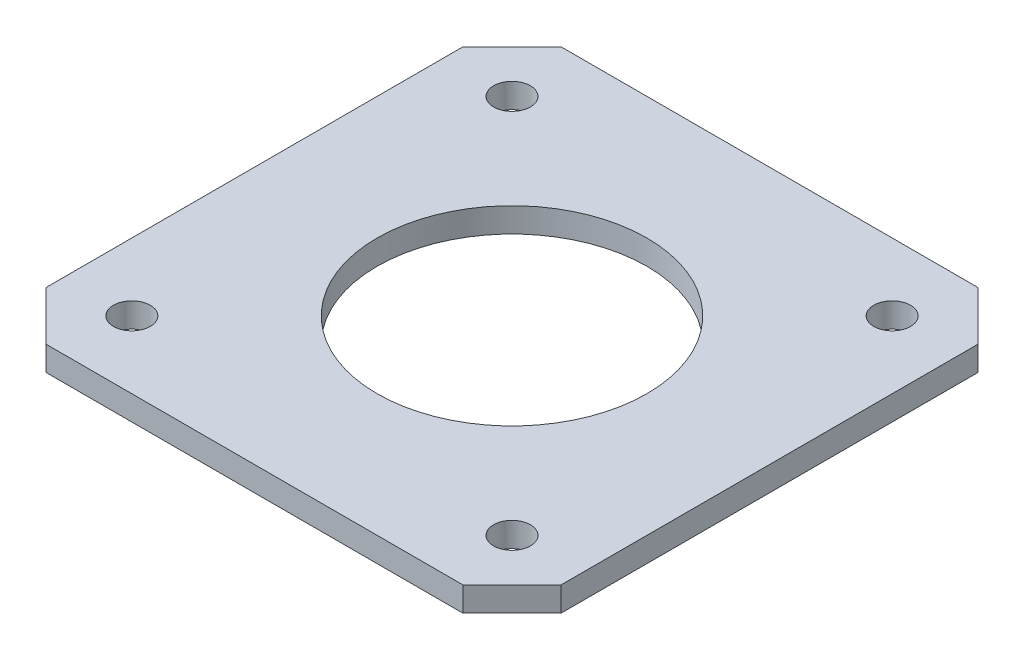
ISO-10303-21;
HEADER;
FILE_DESCRIPTION(('STEP AP214'),'2;1');
FILE_NAME('part.step','',(''),(''),'','','');
FILE_SCHEMA(('AUTOMOTIVE_DESIGN { 1 0 10303 214 1 1 1 1 }'));
ENDSEC;
DATA;
#1=APPLICATION_CONTEXT('core data for automotive mechanical design processes');
#2=APPLICATION_PROTOCOL_DEFINITION('international standard','automotive_design',2000,#1);
#3=PRODUCT_CONTEXT('',#1,'mechanical');
#4=PRODUCT('Part','Part','',(#3));
#5=PRODUCT_RELATED_PRODUCT_CATEGORY('part','',(#4));
#6=PRODUCT_DEFINITION_FORMATION('','',#4);
#7=PRODUCT_DEFINITION_CONTEXT('part definition',#1,'design');
#8=PRODUCT_DEFINITION('design','',#6,#7);
#9=PRODUCT_DEFINITION_SHAPE('','',#8);
#10=(LENGTH_UNIT() NAMED_UNIT(*) SI_UNIT(.MILLI.,.METRE.));
#11=(NAMED_UNIT(*) PLANE_ANGLE_UNIT() SI_UNIT($,.RADIAN.));
#12=(NAMED_UNIT(*) SI_UNIT($,.STERADIAN.) SOLID_ANGLE_UNIT());
#13=UNCERTAINTY_MEASURE_WITH_UNIT(LENGTH_MEASURE(1.E-05),#10,'distance_accuracy_value','');
#14=(GEOMETRIC_REPRESENTATION_CONTEXT(3) GLOBAL_UNCERTAINTY_ASSIGNED_CONTEXT((#13)) GLOBAL_UNIT_ASSIGNED_CONTEXT((#10,
#11,#12)) REPRESENTATION_CONTEXT('',''));
#15=CARTESIAN_POINT('',(0.,0.,0.));
#16=DIRECTION('',(0.,0.,1.));
#17=DIRECTION('',(1.,0.,0.));
#18=AXIS2_PLACEMENT_3D('',#15,#16,#17);
#19=CARTESIAN_POINT('',(0.,11.9638672342777,0.));
#20=DIRECTION('',(0.,1.,0.));
#21=DIRECTION('',(0.,0.,1.));
#22=AXIS2_PLACEMENT_3D('',#19,#20,#21);
#23=PLANE('',#22);
#24=CARTESIAN_POINT('',(71.5224899091758,11.9638672342777,-55.6486117539524));
#25=DIRECTION('',(0.,1.,0.));
#26=DIRECTION('',(0.,0.,1.));
#27=AXIS2_PLACEMENT_3D('',#24,#25,#26);
#28=CIRCLE('',#27,1.5);
#29=CARTESIAN_POINT('',(71.5224899091758,11.9638672342777,-54.1486117539524));
#30=VERTEX_POINT('',#29);
#31=EDGE_CURVE('E195',#30,#30,#28,.T.);
#32=ORIENTED_EDGE('',*,*,#31,.F.);
#33=EDGE_LOOP('',(#32));
#34=FACE_BOUND('',#33,.T.);
#35=CARTESIAN_POINT('',(40.5224899091758,11.9638672342777,-24.6486117539522));
#36=DIRECTION('',(0.,1.,0.));
#37=DIRECTION('',(0.,0.,1.));
#38=AXIS2_PLACEMENT_3D('',#35,#36,#37);
#39=CIRCLE('',#38,1.5);
#40=CARTESIAN_POINT('',(40.5224899091758,11.9638672342777,-23.1486117539522));
#41=VERTEX_POINT('',#40);
#42=EDGE_CURVE('E183',#41,#41,#39,.T.);
#43=ORIENTED_EDGE('',*,*,#42,.F.);
#44=EDGE_LOOP('',(#43));
#45=FACE_BOUND('',#44,.T.);
#46=DIRECTION('',(-1.,0.,0.));
#47=VECTOR('',#46,1.);
#48=CARTESIAN_POINT('',(73.0224899091758,11.9638672342777,-61.1486117539523));
#49=LINE('',#48,#47);
#50=CARTESIAN_POINT('',(73.0224899091758,11.9638672342777,-61.1486117539523));
#51=VERTEX_POINT('',#50);
#52=CARTESIAN_POINT('',(39.0224899091759,11.9638672342777,-61.1486117539523));
#53=VERTEX_POINT('',#52);
#54=EDGE_CURVE('E146',#51,#53,#49,.T.);
#55=ORIENTED_EDGE('',*,*,#54,.T.);
#56=DIRECTION('',(-0.707106781186546,0.,0.707106781186549));
#57=VECTOR('',#56,1.);
#58=CARTESIAN_POINT('',(39.0224899091759,11.9638672342777,-61.1486117539523));
#59=LINE('',#58,#57);
#60=CARTESIAN_POINT('',(35.0224899091758,11.9638672342777,-57.1486117539523));
#61=VERTEX_POINT('',#60);
#62=EDGE_CURVE('E94',#53,#61,#59,.T.);
#63=ORIENTED_EDGE('',*,*,#62,.T.);
#64=DIRECTION('',(0.,0.,1.));
#65=VECTOR('',#64,1.);
#66=CARTESIAN_POINT('',(35.0224899091758,11.9638672342777,-57.1486117539523));
#67=LINE('',#66,#65);
#68=CARTESIAN_POINT('',(35.0224899091758,11.9638672342777,-23.1486117539523));
#69=VERTEX_POINT('',#68);
#70=EDGE_CURVE('E161',#61,#69,#67,.T.);
#71=ORIENTED_EDGE('',*,*,#70,.T.);
#72=DIRECTION('',(0.707106781186546,0.,0.707106781186549));
#73=VECTOR('',#72,1.);
#74=CARTESIAN_POINT('',(35.0224899091758,11.9638672342777,-23.1486117539523));
#75=LINE('',#74,#73);
#76=CARTESIAN_POINT('',(39.0224899091758,11.9638672342777,-19.1486117539523));
#77=VERTEX_POINT('',#76);
#78=EDGE_CURVE('E174',#69,#77,#75,.T.);
#79=ORIENTED_EDGE('',*,*,#78,.T.);
#80=DIRECTION('',(1.,0.,0.));
#81=VECTOR('',#80,1.);
#82=CARTESIAN_POINT('',(39.0224899091758,11.9638672342777,-19.1486117539523));
#83=LINE('',#82,#81);
#84=CARTESIAN_POINT('',(73.0224899091758,11.9638672342777,-19.1486117539523));
#85=VERTEX_POINT('',#84);
#86=EDGE_CURVE('E113',#77,#85,#83,.T.);
#87=ORIENTED_EDGE('',*,*,#86,.T.);
#88=DIRECTION('',(0.707106781186549,0.,-0.707106781186546));
#89=VECTOR('',#88,1.);
#90=CARTESIAN_POINT('',(73.0224899091758,11.9638672342777,-19.1486117539523));
#91=LINE('',#90,#89);
#92=CARTESIAN_POINT('',(77.0224899091758,11.9638672342777,-23.1486117539523));
#93=VERTEX_POINT('',#92);
#94=EDGE_CURVE('E107',#85,#93,#91,.T.);
#95=ORIENTED_EDGE('',*,*,#94,.T.);
#96=DIRECTION('',(0.,0.,-1.));
#97=VECTOR('',#96,1.);
#98=CARTESIAN_POINT('',(77.0224899091758,11.9638672342777,-23.1486117539523));
#99=LINE('',#98,#97);
#100=CARTESIAN_POINT('',(77.0224899091758,11.9638672342777,-57.1486117539523));
#101=VERTEX_POINT('',#100);
#102=EDGE_CURVE('E111',#93,#101,#99,.T.);
#103=ORIENTED_EDGE('',*,*,#102,.T.);
#104=DIRECTION('',(-0.707106781186547,0.,-0.707106781186548));
#105=VECTOR('',#104,1.);
#106=CARTESIAN_POINT('',(77.0224899091758,11.9638672342777,-57.1486117539523));
#107=LINE('',#106,#105);
#108=EDGE_CURVE('E51',#101,#51,#107,.T.);
#109=ORIENTED_EDGE('',*,*,#108,.T.);
#110=EDGE_LOOP('',(#55,#63,#71,#79,#87,#95,#103,#109));
#111=FACE_BOUND('',#110,.T.);
#112=CARTESIAN_POINT('',(56.0224899091758,11.9638672342777,-40.1486117539523));
#113=DIRECTION('',(0.,1.,0.));
#114=DIRECTION('',(0.,0.,1.));
#115=AXIS2_PLACEMENT_3D('',#112,#113,#114);
#116=CIRCLE('',#115,11.);
#117=CARTESIAN_POINT('',(56.0224899091758,11.9638672342777,-29.1486117539523));
#118=VERTEX_POINT('',#117);
#119=EDGE_CURVE('E135',#118,#118,#116,.T.);
#120=ORIENTED_EDGE('',*,*,#119,.F.);
#121=EDGE_LOOP('',(#120));
#122=FACE_BOUND('',#121,.T.);
#123=CARTESIAN_POINT('',(71.5224899091759,11.9638672342777,-24.6486117539522));
#124=DIRECTION('',(0.,1.,0.));
#125=DIRECTION('',(0.,0.,1.));
#126=AXIS2_PLACEMENT_3D('',#123,#124,#125);
#127=CIRCLE('',#126,1.5);
#128=CARTESIAN_POINT('',(71.5224899091759,11.9638672342777,-23.1486117539523));
#129=VERTEX_POINT('',#128);
#130=EDGE_CURVE('E189',#129,#129,#127,.T.);
#131=ORIENTED_EDGE('',*,*,#130,.F.);
#132=EDGE_LOOP('',(#131));
#133=FACE_BOUND('',#132,.T.);
#134=CARTESIAN_POINT('',(40.5224899091759,11.9638672342777,-55.6486117539525));
#135=DIRECTION('',(0.,1.,0.));
#136=DIRECTION('',(0.,0.,1.));
#137=AXIS2_PLACEMENT_3D('',#134,#135,#136);
#138=CIRCLE('',#137,1.5);
#139=CARTESIAN_POINT('',(40.5224899091759,11.9638672342777,-54.1486117539525));
#140=VERTEX_POINT('',#139);
#141=EDGE_CURVE('E201',#140,#140,#138,.T.);
#142=ORIENTED_EDGE('',*,*,#141,.F.);
#143=EDGE_LOOP('',(#142));
#144=FACE_BOUND('',#143,.T.);
#145=ADVANCED_FACE('F34',(#34,#45,#111,#122,#133,#144),#23,.T.);
#146=CARTESIAN_POINT('',(0.,9.9638672342777,0.));
#147=DIRECTION('',(0.,1.,0.));
#148=DIRECTION('',(0.,0.,1.));
#149=AXIS2_PLACEMENT_3D('',#146,#147,#148);
#150=PLANE('',#149);
#151=DIRECTION('',(-1.,0.,0.));
#152=VECTOR('',#151,1.);
#153=CARTESIAN_POINT('',(73.0224899091758,9.9638672342777,-61.1486117539523));
#154=LINE('',#153,#152);
#155=CARTESIAN_POINT('',(73.0224899091758,9.9638672342777,-61.1486117539523));
#156=VERTEX_POINT('',#155);
#157=CARTESIAN_POINT('',(39.0224899091759,9.9638672342777,-61.1486117539523));
#158=VERTEX_POINT('',#157);
#159=EDGE_CURVE('E131',#156,#158,#154,.T.);
#160=ORIENTED_EDGE('',*,*,#159,.F.);
#161=DIRECTION('',(-0.707106781186547,0.,-0.707106781186548));
#162=VECTOR('',#161,1.);
#163=CARTESIAN_POINT('',(77.0224899091758,9.9638672342777,-57.1486117539523));
#164=LINE('',#163,#162);
#165=CARTESIAN_POINT('',(77.0224899091758,9.9638672342777,-57.1486117539523));
#166=VERTEX_POINT('',#165);
#167=EDGE_CURVE('E86',#166,#156,#164,.T.);
#168=ORIENTED_EDGE('',*,*,#167,.F.);
#169=DIRECTION('',(0.,0.,-1.));
#170=VECTOR('',#169,1.);
#171=CARTESIAN_POINT('',(77.0224899091758,9.9638672342777,-23.1486117539523));
#172=LINE('',#171,#170);
#173=CARTESIAN_POINT('',(77.0224899091758,9.9638672342777,-23.1486117539523));
#174=VERTEX_POINT('',#173);
#175=EDGE_CURVE('E80',#174,#166,#172,.T.);
#176=ORIENTED_EDGE('',*,*,#175,.F.);
#177=DIRECTION('',(0.707106781186549,0.,-0.707106781186546));
#178=VECTOR('',#177,1.);
#179=CARTESIAN_POINT('',(73.0224899091758,9.9638672342777,-19.1486117539523));
#180=LINE('',#179,#178);
#181=CARTESIAN_POINT('',(73.0224899091758,9.9638672342777,-19.1486117539523));
#182=VERTEX_POINT('',#181);
#183=EDGE_CURVE('E121',#182,#174,#180,.T.);
#184=ORIENTED_EDGE('',*,*,#183,.F.);
#185=DIRECTION('',(1.,0.,0.));
#186=VECTOR('',#185,1.);
#187=CARTESIAN_POINT('',(39.0224899091758,9.9638672342777,-19.1486117539523));
#188=LINE('',#187,#186);
#189=CARTESIAN_POINT('',(39.0224899091758,9.9638672342777,-19.1486117539523));
#190=VERTEX_POINT('',#189);
#191=EDGE_CURVE('E141',#190,#182,#188,.T.);
#192=ORIENTED_EDGE('',*,*,#191,.F.);
#193=DIRECTION('',(0.707106781186546,0.,0.707106781186549));
#194=VECTOR('',#193,1.);
#195=CARTESIAN_POINT('',(35.0224899091758,9.9638672342777,-23.1486117539523));
#196=LINE('',#195,#194);
#197=CARTESIAN_POINT('',(35.0224899091758,9.9638672342777,-23.1486117539523));
#198=VERTEX_POINT('',#197);
#199=EDGE_CURVE('E139',#198,#190,#196,.T.);
#200=ORIENTED_EDGE('',*,*,#199,.F.);
#201=DIRECTION('',(0.,0.,1.));
#202=VECTOR('',#201,1.);
#203=CARTESIAN_POINT('',(35.0224899091758,9.9638672342777,-57.1486117539523));
#204=LINE('',#203,#202);
#205=CARTESIAN_POINT('',(35.0224899091758,9.9638672342777,-57.1486117539523));
#206=VERTEX_POINT('',#205);
#207=EDGE_CURVE('E137',#206,#198,#204,.T.);
#208=ORIENTED_EDGE('',*,*,#207,.F.);
#209=DIRECTION('',(-0.707106781186546,0.,0.707106781186549));
#210=VECTOR('',#209,1.);
#211=CARTESIAN_POINT('',(39.0224899091759,9.9638672342777,-61.1486117539523));
#212=LINE('',#211,#210);
#213=EDGE_CURVE('E134',#158,#206,#212,.T.);
#214=ORIENTED_EDGE('',*,*,#213,.F.);
#215=EDGE_LOOP('',(#160,#168,#176,#184,#192,#200,#208,#214));
#216=FACE_BOUND('',#215,.T.);
#217=CARTESIAN_POINT('',(56.0224899091758,9.9638672342777,-40.1486117539523));
#218=DIRECTION('',(0.,1.,0.));
#219=DIRECTION('',(0.,0.,1.));
#220=AXIS2_PLACEMENT_3D('',#217,#218,#219);
#221=CIRCLE('',#220,11.);
#222=CARTESIAN_POINT('',(56.0224899091758,9.9638672342777,-29.1486117539523));
#223=VERTEX_POINT('',#222);
#224=EDGE_CURVE('E180',#223,#223,#221,.T.);
#225=ORIENTED_EDGE('',*,*,#224,.T.);
#226=EDGE_LOOP('',(#225));
#227=FACE_BOUND('',#226,.T.);
#228=CARTESIAN_POINT('',(40.5224899091758,9.9638672342777,-24.6486117539522));
#229=DIRECTION('',(0.,1.,0.));
#230=DIRECTION('',(0.,0.,1.));
#231=AXIS2_PLACEMENT_3D('',#228,#229,#230);
#232=CIRCLE('',#231,1.5);
#233=CARTESIAN_POINT('',(40.5224899091758,9.9638672342777,-23.1486117539522));
#234=VERTEX_POINT('',#233);
#235=EDGE_CURVE('E186',#234,#234,#232,.T.);
#236=ORIENTED_EDGE('',*,*,#235,.T.);
#237=EDGE_LOOP('',(#236));
#238=FACE_BOUND('',#237,.T.);
#239=CARTESIAN_POINT('',(71.5224899091759,9.9638672342777,-24.6486117539522));
#240=DIRECTION('',(0.,1.,0.));
#241=DIRECTION('',(0.,0.,1.));
#242=AXIS2_PLACEMENT_3D('',#239,#240,#241);
#243=CIRCLE('',#242,1.5);
#244=CARTESIAN_POINT('',(71.5224899091759,9.9638672342777,-23.1486117539523));
#245=VERTEX_POINT('',#244);
#246=EDGE_CURVE('E192',#245,#245,#243,.T.);
#247=ORIENTED_EDGE('',*,*,#246,.T.);
#248=EDGE_LOOP('',(#247));
#249=FACE_BOUND('',#248,.T.);
#250=CARTESIAN_POINT('',(71.5224899091758,9.9638672342777,-55.6486117539524));
#251=DIRECTION('',(0.,1.,0.));
#252=DIRECTION('',(0.,0.,1.));
#253=AXIS2_PLACEMENT_3D('',#250,#251,#252);
#254=CIRCLE('',#253,1.5);
#255=CARTESIAN_POINT('',(71.5224899091758,9.9638672342777,-54.1486117539524));
#256=VERTEX_POINT('',#255);
#257=EDGE_CURVE('E198',#256,#256,#254,.T.);
#258=ORIENTED_EDGE('',*,*,#257,.T.);
#259=EDGE_LOOP('',(#258));
#260=FACE_BOUND('',#259,.T.);
#261=CARTESIAN_POINT('',(40.5224899091759,9.9638672342777,-55.6486117539525));
#262=DIRECTION('',(0.,1.,0.));
#263=DIRECTION('',(0.,0.,1.));
#264=AXIS2_PLACEMENT_3D('',#261,#262,#263);
#265=CIRCLE('',#264,1.5);
#266=CARTESIAN_POINT('',(40.5224899091759,9.9638672342777,-54.1486117539525));
#267=VERTEX_POINT('',#266);
#268=EDGE_CURVE('E204',#267,#267,#265,.T.);
#269=ORIENTED_EDGE('',*,*,#268,.T.);
#270=EDGE_LOOP('',(#269));
#271=FACE_BOUND('',#270,.T.);
#272=ADVANCED_FACE('F165',(#216,#227,#238,#249,#260,#271),#150,.F.);
#273=CARTESIAN_POINT('',(73.0224899091758,11.9638672342777,-61.1486117539523));
#274=DIRECTION('',(0.,0.,1.));
#275=DIRECTION('',(1.,0.,0.));
#276=AXIS2_PLACEMENT_3D('',#273,#274,#275);
#277=PLANE('',#276);
#278=ORIENTED_EDGE('',*,*,#159,.T.);
#279=DIRECTION('',(0.,-1.,0.));
#280=VECTOR('',#279,1.);
#281=CARTESIAN_POINT('',(39.0224899091759,11.9638672342777,-61.1486117539523));
#282=LINE('',#281,#280);
#283=EDGE_CURVE('E11',#53,#158,#282,.T.);
#284=ORIENTED_EDGE('',*,*,#283,.F.);
#285=ORIENTED_EDGE('',*,*,#54,.F.);
#286=DIRECTION('',(0.,-1.,0.));
#287=VECTOR('',#286,1.);
#288=CARTESIAN_POINT('',(73.0224899091758,11.9638672342777,-61.1486117539523));
#289=LINE('',#288,#287);
#290=EDGE_CURVE('E127',#51,#156,#289,.T.);
#291=ORIENTED_EDGE('',*,*,#290,.T.);
#292=EDGE_LOOP('',(#278,#284,#285,#291));
#293=FACE_BOUND('',#292,.T.);
#294=ADVANCED_FACE('F36',(#293),#277,.F.);
#295=CARTESIAN_POINT('',(39.0224899091759,11.9638672342777,-61.1486117539523));
#296=DIRECTION('',(0.707106781186549,0.,0.707106781186546));
#297=DIRECTION('',(0.707106781186546,0.,-0.707106781186549));
#298=AXIS2_PLACEMENT_3D('',#295,#296,#297);
#299=PLANE('',#298);
#300=ORIENTED_EDGE('',*,*,#213,.T.);
#301=DIRECTION('',(0.,-1.,0.));
#302=VECTOR('',#301,1.);
#303=CARTESIAN_POINT('',(35.0224899091758,11.9638672342777,-57.1486117539523));
#304=LINE('',#303,#302);
#305=EDGE_CURVE('E43',#61,#206,#304,.T.);
#306=ORIENTED_EDGE('',*,*,#305,.F.);
#307=ORIENTED_EDGE('',*,*,#62,.F.);
#308=ORIENTED_EDGE('',*,*,#283,.T.);
#309=EDGE_LOOP('',(#300,#306,#307,#308));
#310=FACE_BOUND('',#309,.T.);
#311=ADVANCED_FACE('F238',(#310),#299,.F.);
#312=CARTESIAN_POINT('',(35.0224899091758,11.9638672342777,-57.1486117539523));
#313=DIRECTION('',(1.,0.,0.));
#314=DIRECTION('',(0.,0.,-1.));
#315=AXIS2_PLACEMENT_3D('',#312,#313,#314);
#316=PLANE('',#315);
#317=ORIENTED_EDGE('',*,*,#207,.T.);
#318=DIRECTION('',(0.,-1.,0.));
#319=VECTOR('',#318,1.);
#320=CARTESIAN_POINT('',(35.0224899091758,11.9638672342777,-23.1486117539523));
#321=LINE('',#320,#319);
#322=EDGE_CURVE('E153',#69,#198,#321,.T.);
#323=ORIENTED_EDGE('',*,*,#322,.F.);
#324=ORIENTED_EDGE('',*,*,#70,.F.);
#325=ORIENTED_EDGE('',*,*,#305,.T.);
#326=EDGE_LOOP('',(#317,#323,#324,#325));
#327=FACE_BOUND('',#326,.T.);
#328=ADVANCED_FACE('F159',(#327),#316,.F.);
#329=CARTESIAN_POINT('',(35.0224899091758,11.9638672342777,-23.1486117539523));
#330=DIRECTION('',(0.707106781186549,0.,-0.707106781186546));
#331=DIRECTION('',(-0.707106781186546,0.,-0.707106781186549));
#332=AXIS2_PLACEMENT_3D('',#329,#330,#331);
#333=PLANE('',#332);
#334=ORIENTED_EDGE('',*,*,#199,.T.);
#335=DIRECTION('',(0.,-1.,0.));
#336=VECTOR('',#335,1.);
#337=CARTESIAN_POINT('',(39.0224899091758,11.9638672342777,-19.1486117539523));
#338=LINE('',#337,#336);
#339=EDGE_CURVE('E150',#77,#190,#338,.T.);
#340=ORIENTED_EDGE('',*,*,#339,.F.);
#341=ORIENTED_EDGE('',*,*,#78,.F.);
#342=ORIENTED_EDGE('',*,*,#322,.T.);
#343=EDGE_LOOP('',(#334,#340,#341,#342));
#344=FACE_BOUND('',#343,.T.);
#345=ADVANCED_FACE('F170',(#344),#333,.F.);
#346=CARTESIAN_POINT('',(39.0224899091758,11.9638672342777,-19.1486117539523));
#347=DIRECTION('',(0.,0.,-1.));
#348=DIRECTION('',(-1.,0.,0.));
#349=AXIS2_PLACEMENT_3D('',#346,#347,#348);
#350=PLANE('',#349);
#351=ORIENTED_EDGE('',*,*,#191,.T.);
#352=DIRECTION('',(0.,-1.,0.));
#353=VECTOR('',#352,1.);
#354=CARTESIAN_POINT('',(73.0224899091758,11.9638672342777,-19.1486117539523));
#355=LINE('',#354,#353);
#356=EDGE_CURVE('E122',#85,#182,#355,.T.);
#357=ORIENTED_EDGE('',*,*,#356,.F.);
#358=ORIENTED_EDGE('',*,*,#86,.F.);
#359=ORIENTED_EDGE('',*,*,#339,.T.);
#360=EDGE_LOOP('',(#351,#357,#358,#359));
#361=FACE_BOUND('',#360,.T.);
#362=ADVANCED_FACE('F173',(#361),#350,.F.);
#363=CARTESIAN_POINT('',(73.0224899091758,11.9638672342777,-19.1486117539523));
#364=DIRECTION('',(-0.707106781186546,0.,-0.707106781186549));
#365=DIRECTION('',(-0.707106781186549,0.,0.707106781186546));
#366=AXIS2_PLACEMENT_3D('',#363,#364,#365);
#367=PLANE('',#366);
#368=ORIENTED_EDGE('',*,*,#183,.T.);
#369=DIRECTION('',(0.,-1.,0.));
#370=VECTOR('',#369,1.);
#371=CARTESIAN_POINT('',(77.0224899091758,11.9638672342777,-23.1486117539523));
#372=LINE('',#371,#370);
#373=EDGE_CURVE('E118',#93,#174,#372,.T.);
#374=ORIENTED_EDGE('',*,*,#373,.F.);
#375=ORIENTED_EDGE('',*,*,#94,.F.);
#376=ORIENTED_EDGE('',*,*,#356,.T.);
#377=EDGE_LOOP('',(#368,#374,#375,#376));
#378=FACE_BOUND('',#377,.T.);
#379=ADVANCED_FACE('F119',(#378),#367,.F.);
#380=CARTESIAN_POINT('',(77.0224899091758,11.9638672342777,-23.1486117539523));
#381=DIRECTION('',(-1.,0.,0.));
#382=DIRECTION('',(0.,0.,1.));
#383=AXIS2_PLACEMENT_3D('',#380,#381,#382);
#384=PLANE('',#383);
#385=ORIENTED_EDGE('',*,*,#175,.T.);
#386=DIRECTION('',(0.,-1.,0.));
#387=VECTOR('',#386,1.);
#388=CARTESIAN_POINT('',(77.0224899091758,11.9638672342777,-57.1486117539523));
#389=LINE('',#388,#387);
#390=EDGE_CURVE('E123',#101,#166,#389,.T.);
#391=ORIENTED_EDGE('',*,*,#390,.F.);
#392=ORIENTED_EDGE('',*,*,#102,.F.);
#393=ORIENTED_EDGE('',*,*,#373,.T.);
#394=EDGE_LOOP('',(#385,#391,#392,#393));
#395=FACE_BOUND('',#394,.T.);
#396=ADVANCED_FACE('F125',(#395),#384,.F.);
#397=CARTESIAN_POINT('',(77.0224899091758,11.9638672342777,-57.1486117539523));
#398=DIRECTION('',(-0.707106781186548,0.,0.707106781186547));
#399=DIRECTION('',(0.707106781186547,0.,0.707106781186548));
#400=AXIS2_PLACEMENT_3D('',#397,#398,#399);
#401=PLANE('',#400);
#402=ORIENTED_EDGE('',*,*,#167,.T.);
#403=ORIENTED_EDGE('',*,*,#290,.F.);
#404=ORIENTED_EDGE('',*,*,#108,.F.);
#405=ORIENTED_EDGE('',*,*,#390,.T.);
#406=EDGE_LOOP('',(#402,#403,#404,#405));
#407=FACE_BOUND('',#406,.T.);
#408=ADVANCED_FACE('F226',(#407),#401,.F.);
#409=CARTESIAN_POINT('',(56.0224899091758,11.9638672342777,-40.1486117539523));
#410=DIRECTION('',(0.,-1.,0.));
#411=DIRECTION('',(0.,0.,-1.));
#412=AXIS2_PLACEMENT_3D('',#409,#410,#411);
#413=CYLINDRICAL_SURFACE('',#412,11.);
#414=ORIENTED_EDGE('',*,*,#119,.T.);
#415=EDGE_LOOP('',(#414));
#416=FACE_BOUND('',#415,.T.);
#417=ORIENTED_EDGE('',*,*,#224,.F.);
#418=EDGE_LOOP('',(#417));
#419=FACE_BOUND('',#418,.T.);
#420=ADVANCED_FACE('F223',(#416,#419),#413,.F.);
#421=CARTESIAN_POINT('',(40.5224899091758,11.9638672342777,-24.6486117539522));
#422=DIRECTION('',(0.,-1.,0.));
#423=DIRECTION('',(0.,0.,-1.));
#424=AXIS2_PLACEMENT_3D('',#421,#422,#423);
#425=CYLINDRICAL_SURFACE('',#424,1.5);
#426=ORIENTED_EDGE('',*,*,#42,.T.);
#427=EDGE_LOOP('',(#426));
#428=FACE_BOUND('',#427,.T.);
#429=ORIENTED_EDGE('',*,*,#235,.F.);
#430=EDGE_LOOP('',(#429));
#431=FACE_BOUND('',#430,.T.);
#432=ADVANCED_FACE('F302',(#428,#431),#425,.F.);
#433=CARTESIAN_POINT('',(71.5224899091759,11.9638672342777,-24.6486117539522));
#434=DIRECTION('',(0.,-1.,0.));
#435=DIRECTION('',(0.,0.,-1.));
#436=AXIS2_PLACEMENT_3D('',#433,#434,#435);
#437=CYLINDRICAL_SURFACE('',#436,1.5);
#438=ORIENTED_EDGE('',*,*,#130,.T.);
#439=EDGE_LOOP('',(#438));
#440=FACE_BOUND('',#439,.T.);
#441=ORIENTED_EDGE('',*,*,#246,.F.);
#442=EDGE_LOOP('',(#441));
#443=FACE_BOUND('',#442,.T.);
#444=ADVANCED_FACE('F310',(#440,#443),#437,.F.);
#445=CARTESIAN_POINT('',(71.5224899091758,11.9638672342777,-55.6486117539524));
#446=DIRECTION('',(0.,-1.,0.));
#447=DIRECTION('',(0.,0.,-1.));
#448=AXIS2_PLACEMENT_3D('',#445,#446,#447);
#449=CYLINDRICAL_SURFACE('',#448,1.5);
#450=ORIENTED_EDGE('',*,*,#31,.T.);
#451=EDGE_LOOP('',(#450));
#452=FACE_BOUND('',#451,.T.);
#453=ORIENTED_EDGE('',*,*,#257,.F.);
#454=EDGE_LOOP('',(#453));
#455=FACE_BOUND('',#454,.T.);
#456=ADVANCED_FACE('F318',(#452,#455),#449,.F.);
#457=CARTESIAN_POINT('',(40.5224899091759,11.9638672342777,-55.6486117539525));
#458=DIRECTION('',(0.,-1.,0.));
#459=DIRECTION('',(0.,0.,-1.));
#460=AXIS2_PLACEMENT_3D('',#457,#458,#459);
#461=CYLINDRICAL_SURFACE('',#460,1.5);
#462=ORIENTED_EDGE('',*,*,#141,.T.);
#463=EDGE_LOOP('',(#462));
#464=FACE_BOUND('',#463,.T.);
#465=ORIENTED_EDGE('',*,*,#268,.F.);
#466=EDGE_LOOP('',(#465));
#467=FACE_BOUND('',#466,.T.);
#468=ADVANCED_FACE('F210',(#464,#467),#461,.F.);
#469=CLOSED_SHELL('',(#145,#272,#294,#311,#328,#345,#362,#379,#396,#408,#420,#432,#444,#456,#468));
#470=MANIFOLD_SOLID_BREP('B2',#469);
#471=ADVANCED_BREP_SHAPE_REPRESENTATION('',(#18,#470),#14);
#472=SHAPE_DEFINITION_REPRESENTATION(#9,#471);
ENDSEC;
END-ISO-10303-21;
